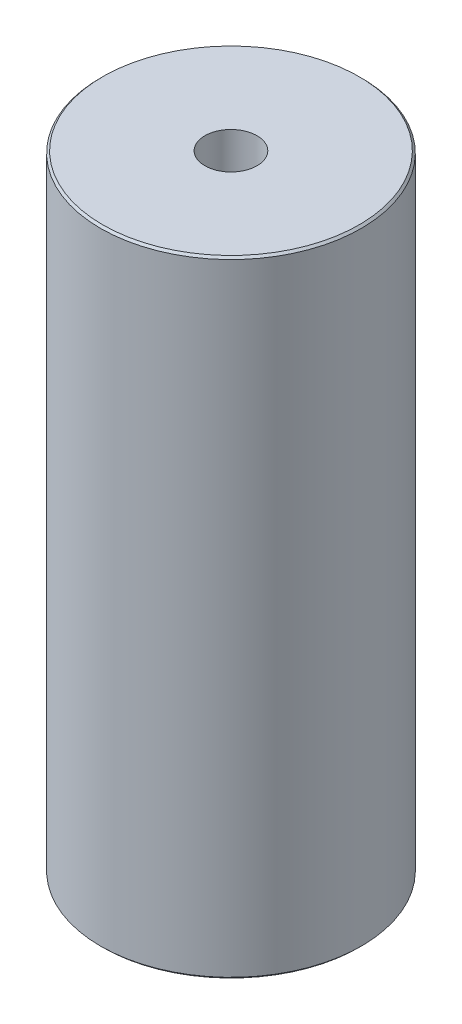
ISO-10303-21;
HEADER;
FILE_DESCRIPTION(('STEP AP214'),'2;1');
FILE_NAME('part.step','',(''),(''),'','','');
FILE_SCHEMA(('AUTOMOTIVE_DESIGN { 1 0 10303 214 1 1 1 1 }'));
ENDSEC;
DATA;
#1=APPLICATION_CONTEXT('core data for automotive mechanical design processes');
#2=APPLICATION_PROTOCOL_DEFINITION('international standard','automotive_design',2000,#1);
#3=PRODUCT_CONTEXT('',#1,'mechanical');
#4=PRODUCT('Part','Part','',(#3));
#5=PRODUCT_RELATED_PRODUCT_CATEGORY('part','',(#4));
#6=PRODUCT_DEFINITION_FORMATION('','',#4);
#7=PRODUCT_DEFINITION_CONTEXT('part definition',#1,'design');
#8=PRODUCT_DEFINITION('design','',#6,#7);
#9=PRODUCT_DEFINITION_SHAPE('','',#8);
#10=(LENGTH_UNIT() NAMED_UNIT(*) SI_UNIT(.MILLI.,.METRE.));
#11=(NAMED_UNIT(*) PLANE_ANGLE_UNIT() SI_UNIT($,.RADIAN.));
#12=(NAMED_UNIT(*) SI_UNIT($,.STERADIAN.) SOLID_ANGLE_UNIT());
#13=UNCERTAINTY_MEASURE_WITH_UNIT(LENGTH_MEASURE(1.E-05),#10,'distance_accuracy_value','');
#14=(GEOMETRIC_REPRESENTATION_CONTEXT(3) GLOBAL_UNCERTAINTY_ASSIGNED_CONTEXT((#13)) GLOBAL_UNIT_ASSIGNED_CONTEXT((#10,
#11,#12)) REPRESENTATION_CONTEXT('',''));
#15=CARTESIAN_POINT('',(0.,0.,0.));
#16=DIRECTION('',(0.,0.,1.));
#17=DIRECTION('',(1.,0.,0.));
#18=AXIS2_PLACEMENT_3D('',#15,#16,#17);
#19=CARTESIAN_POINT('',(0.,60.,0.));
#20=DIRECTION('',(0.,-1.,0.));
#21=DIRECTION('',(0.,0.,-1.));
#22=AXIS2_PLACEMENT_3D('',#19,#20,#21);
#23=CYLINDRICAL_SURFACE('',#22,12.5);
#24=CARTESIAN_POINT('',(0.,0.200000000000006,0.));
#25=DIRECTION('',(0.,1.,0.));
#26=DIRECTION('',(0.,0.,1.));
#27=AXIS2_PLACEMENT_3D('',#24,#25,#26);
#28=CIRCLE('',#27,12.5);
#29=CARTESIAN_POINT('',(0.,0.200000000000006,12.5));
#30=VERTEX_POINT('',#29);
#31=EDGE_CURVE('E64',#30,#30,#28,.T.);
#32=ORIENTED_EDGE('',*,*,#31,.T.);
#33=EDGE_LOOP('',(#32));
#34=FACE_BOUND('',#33,.T.);
#35=CARTESIAN_POINT('',(0.,59.8,0.));
#36=DIRECTION('',(0.,1.,0.));
#37=DIRECTION('',(0.,0.,1.));
#38=AXIS2_PLACEMENT_3D('',#35,#36,#37);
#39=CIRCLE('',#38,12.5);
#40=CARTESIAN_POINT('',(0.,59.8,12.5));
#41=VERTEX_POINT('',#40);
#42=EDGE_CURVE('E60',#41,#41,#39,.F.);
#43=ORIENTED_EDGE('',*,*,#42,.T.);
#44=EDGE_LOOP('',(#43));
#45=FACE_BOUND('',#44,.T.);
#46=ADVANCED_FACE('F40',(#34,#45),#23,.T.);
#47=CARTESIAN_POINT('',(0.,60.,0.));
#48=DIRECTION('',(0.,1.,0.));
#49=DIRECTION('',(0.,0.,1.));
#50=AXIS2_PLACEMENT_3D('',#47,#48,#49);
#51=PLANE('',#50);
#52=CARTESIAN_POINT('',(0.,60.,0.));
#53=DIRECTION('',(0.,1.,0.));
#54=DIRECTION('',(0.,0.,1.));
#55=AXIS2_PLACEMENT_3D('',#52,#53,#54);
#56=CIRCLE('',#55,12.3);
#57=CARTESIAN_POINT('',(0.,60.,12.3));
#58=VERTEX_POINT('',#57);
#59=EDGE_CURVE('E11',#58,#58,#56,.T.);
#60=ORIENTED_EDGE('',*,*,#59,.T.);
#61=EDGE_LOOP('',(#60));
#62=FACE_BOUND('',#61,.T.);
#63=CARTESIAN_POINT('',(0.,60.,0.));
#64=DIRECTION('',(0.,1.,0.));
#65=DIRECTION('',(0.,0.,1.));
#66=AXIS2_PLACEMENT_3D('',#63,#64,#65);
#67=CIRCLE('',#66,2.49999999999999);
#68=CARTESIAN_POINT('',(0.,60.,2.49999999999999));
#69=VERTEX_POINT('',#68);
#70=EDGE_CURVE('E61',#69,#69,#67,.T.);
#71=ORIENTED_EDGE('',*,*,#70,.F.);
#72=EDGE_LOOP('',(#71));
#73=FACE_BOUND('',#72,.T.);
#74=ADVANCED_FACE('F81',(#62,#73),#51,.T.);
#75=CARTESIAN_POINT('',(0.,0.,0.));
#76=DIRECTION('',(0.,1.,0.));
#77=DIRECTION('',(0.,0.,1.));
#78=AXIS2_PLACEMENT_3D('',#75,#76,#77);
#79=PLANE('',#78);
#80=CARTESIAN_POINT('',(0.,0.,0.));
#81=DIRECTION('',(0.,1.,0.));
#82=DIRECTION('',(0.,0.,1.));
#83=AXIS2_PLACEMENT_3D('',#80,#81,#82);
#84=CIRCLE('',#83,12.3);
#85=CARTESIAN_POINT('',(0.,0.,12.3));
#86=VERTEX_POINT('',#85);
#87=EDGE_CURVE('E47',#86,#86,#84,.F.);
#88=ORIENTED_EDGE('',*,*,#87,.T.);
#89=EDGE_LOOP('',(#88));
#90=FACE_BOUND('',#89,.T.);
#91=ADVANCED_FACE('F54',(#90),#79,.F.);
#92=CARTESIAN_POINT('',(0.,45.,0.));
#93=DIRECTION('',(0.,1.,0.));
#94=DIRECTION('',(0.,0.,1.));
#95=AXIS2_PLACEMENT_3D('',#92,#93,#94);
#96=CONICAL_SURFACE('',#95,2.49999999999999,1.02974425867665);
#97=CARTESIAN_POINT('',(0.,43.4978484524311,0.));
#98=VERTEX_POINT('',#97);
#99=VERTEX_LOOP('',#98);
#100=FACE_BOUND('',#99,.T.);
#101=CARTESIAN_POINT('',(0.,45.,0.));
#102=DIRECTION('',(0.,1.,0.));
#103=DIRECTION('',(0.,0.,1.));
#104=AXIS2_PLACEMENT_3D('',#101,#102,#103);
#105=CIRCLE('',#104,2.49999999999999);
#106=CARTESIAN_POINT('',(0.,45.,2.49999999999999));
#107=VERTEX_POINT('',#106);
#108=EDGE_CURVE('E58',#107,#107,#105,.T.);
#109=ORIENTED_EDGE('',*,*,#108,.T.);
#110=EDGE_LOOP('',(#109));
#111=FACE_BOUND('',#110,.T.);
#112=ADVANCED_FACE('F50',(#100,#111),#96,.F.);
#113=CARTESIAN_POINT('',(0.,60.,0.));
#114=DIRECTION('',(0.,1.,0.));
#115=DIRECTION('',(0.,0.,1.));
#116=AXIS2_PLACEMENT_3D('',#113,#114,#115);
#117=CYLINDRICAL_SURFACE('',#116,2.49999999999999);
#118=ORIENTED_EDGE('',*,*,#108,.F.);
#119=EDGE_LOOP('',(#118));
#120=FACE_BOUND('',#119,.T.);
#121=ORIENTED_EDGE('',*,*,#70,.T.);
#122=EDGE_LOOP('',(#121));
#123=FACE_BOUND('',#122,.T.);
#124=ADVANCED_FACE('F53',(#120,#123),#117,.F.);
#125=CARTESIAN_POINT('',(0.,0.200000000000006,0.));
#126=DIRECTION('',(0.,1.,0.));
#127=DIRECTION('',(0.,0.,1.));
#128=AXIS2_PLACEMENT_3D('',#125,#126,#127);
#129=CONICAL_SURFACE('',#128,12.5,0.785398163397457);
#130=ORIENTED_EDGE('',*,*,#87,.F.);
#131=EDGE_LOOP('',(#130));
#132=FACE_BOUND('',#131,.T.);
#133=ORIENTED_EDGE('',*,*,#31,.F.);
#134=EDGE_LOOP('',(#133));
#135=FACE_BOUND('',#134,.T.);
#136=ADVANCED_FACE('F74',(#132,#135),#129,.T.);
#137=CARTESIAN_POINT('',(0.,60.,0.));
#138=DIRECTION('',(0.,-1.,0.));
#139=DIRECTION('',(0.,0.,-1.));
#140=AXIS2_PLACEMENT_3D('',#137,#138,#139);
#141=CONICAL_SURFACE('',#140,12.3,0.78539816339744);
#142=ORIENTED_EDGE('',*,*,#42,.F.);
#143=EDGE_LOOP('',(#142));
#144=FACE_BOUND('',#143,.T.);
#145=ORIENTED_EDGE('',*,*,#59,.F.);
#146=EDGE_LOOP('',(#145));
#147=FACE_BOUND('',#146,.T.);
#148=ADVANCED_FACE('F42',(#144,#147),#141,.T.);
#149=CLOSED_SHELL('',(#46,#74,#91,#112,#124,#136,#148));
#150=MANIFOLD_SOLID_BREP('B2',#149);
#151=ADVANCED_BREP_SHAPE_REPRESENTATION('',(#18,#150),#14);
#152=SHAPE_DEFINITION_REPRESENTATION(#9,#151);
ENDSEC;
END-ISO-10303-21;
